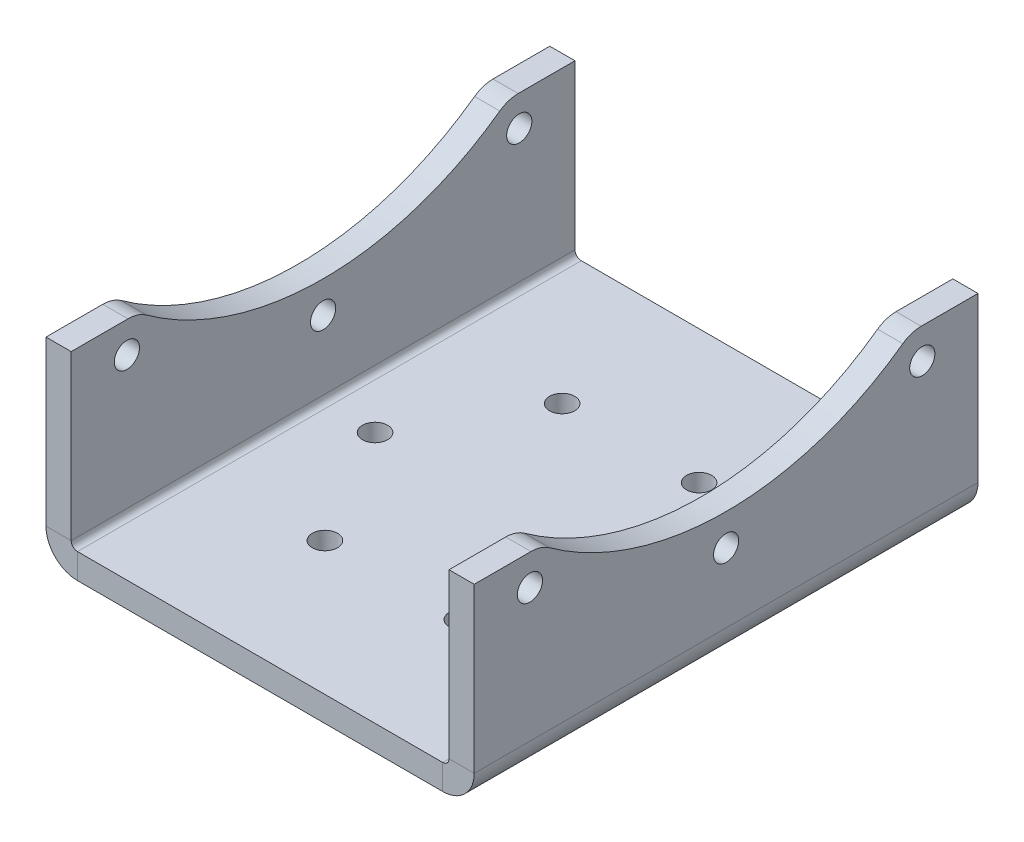
ISO-10303-21;
HEADER;
FILE_DESCRIPTION(('STEP AP214'),'2;1');
FILE_NAME('part.step','',(''),(''),'','','');
FILE_SCHEMA(('AUTOMOTIVE_DESIGN { 1 0 10303 214 1 1 1 1 }'));
ENDSEC;
DATA;
#1=APPLICATION_CONTEXT('core data for automotive mechanical design processes');
#2=APPLICATION_PROTOCOL_DEFINITION('international standard','automotive_design',2000,#1);
#3=PRODUCT_CONTEXT('',#1,'mechanical');
#4=PRODUCT('Part','Part','',(#3));
#5=PRODUCT_RELATED_PRODUCT_CATEGORY('part','',(#4));
#6=PRODUCT_DEFINITION_FORMATION('','',#4);
#7=PRODUCT_DEFINITION_CONTEXT('part definition',#1,'design');
#8=PRODUCT_DEFINITION('design','',#6,#7);
#9=PRODUCT_DEFINITION_SHAPE('','',#8);
#10=(LENGTH_UNIT() NAMED_UNIT(*) SI_UNIT(.MILLI.,.METRE.));
#11=(NAMED_UNIT(*) PLANE_ANGLE_UNIT() SI_UNIT($,.RADIAN.));
#12=(NAMED_UNIT(*) SI_UNIT($,.STERADIAN.) SOLID_ANGLE_UNIT());
#13=UNCERTAINTY_MEASURE_WITH_UNIT(LENGTH_MEASURE(1.E-05),#10,'distance_accuracy_value','');
#14=(GEOMETRIC_REPRESENTATION_CONTEXT(3) GLOBAL_UNCERTAINTY_ASSIGNED_CONTEXT((#13)) GLOBAL_UNIT_ASSIGNED_CONTEXT((#10,
#11,#12)) REPRESENTATION_CONTEXT('',''));
#15=CARTESIAN_POINT('',(0.,0.,0.));
#16=DIRECTION('',(0.,0.,1.));
#17=DIRECTION('',(1.,0.,0.));
#18=AXIS2_PLACEMENT_3D('',#15,#16,#17);
#19=CARTESIAN_POINT('',(-34.,27.,80.));
#20=DIRECTION('',(0.,1.,0.));
#21=DIRECTION('',(0.,0.,1.));
#22=AXIS2_PLACEMENT_3D('',#19,#20,#21);
#23=PLANE('',#22);
#24=DIRECTION('',(0.,0.,-1.));
#25=VECTOR('',#24,1.);
#26=CARTESIAN_POINT('',(-34.,27.,80.));
#27=LINE('',#26,#25);
#28=CARTESIAN_POINT('',(-34.,27.,9.01613323034062));
#29=VERTEX_POINT('',#28);
#30=CARTESIAN_POINT('',(-34.,27.,0.));
#31=VERTEX_POINT('',#30);
#32=EDGE_CURVE('E300',#29,#31,#27,.T.);
#33=ORIENTED_EDGE('',*,*,#32,.F.);
#34=DIRECTION('',(1.,0.,0.));
#35=VECTOR('',#34,1.);
#36=CARTESIAN_POINT('',(-30.,27.,9.01613323034061));
#37=LINE('',#36,#35);
#38=CARTESIAN_POINT('',(-30.,27.,9.01613323034062));
#39=VERTEX_POINT('',#38);
#40=EDGE_CURVE('E346',#29,#39,#37,.T.);
#41=ORIENTED_EDGE('',*,*,#40,.T.);
#42=DIRECTION('',(0.,0.,-1.));
#43=VECTOR('',#42,1.);
#44=CARTESIAN_POINT('',(-30.,27.,80.));
#45=LINE('',#44,#43);
#46=CARTESIAN_POINT('',(-30.,27.,0.));
#47=VERTEX_POINT('',#46);
#48=EDGE_CURVE('E198',#39,#47,#45,.T.);
#49=ORIENTED_EDGE('',*,*,#48,.T.);
#50=DIRECTION('',(1.,0.,0.));
#51=VECTOR('',#50,1.);
#52=CARTESIAN_POINT('',(-34.,27.,0.));
#53=LINE('',#52,#51);
#54=EDGE_CURVE('E238',#31,#47,#53,.T.);
#55=ORIENTED_EDGE('',*,*,#54,.F.);
#56=EDGE_LOOP('',(#33,#41,#49,#55));
#57=FACE_BOUND('',#56,.T.);
#58=ADVANCED_FACE('F38',(#57),#23,.T.);
#59=CARTESIAN_POINT('',(30.,27.,80.));
#60=DIRECTION('',(0.,1.,0.));
#61=DIRECTION('',(0.,0.,1.));
#62=AXIS2_PLACEMENT_3D('',#59,#60,#61);
#63=PLANE('',#62);
#64=DIRECTION('',(0.,0.,-1.));
#65=VECTOR('',#64,1.);
#66=CARTESIAN_POINT('',(30.,27.,80.));
#67=LINE('',#66,#65);
#68=CARTESIAN_POINT('',(30.,27.,9.0161332303406));
#69=VERTEX_POINT('',#68);
#70=CARTESIAN_POINT('',(30.,27.,0.));
#71=VERTEX_POINT('',#70);
#72=EDGE_CURVE('E281',#69,#71,#67,.T.);
#73=ORIENTED_EDGE('',*,*,#72,.F.);
#74=DIRECTION('',(1.,0.,0.));
#75=VECTOR('',#74,1.);
#76=CARTESIAN_POINT('',(34.,27.,9.0161332303406));
#77=LINE('',#76,#75);
#78=CARTESIAN_POINT('',(34.,27.,9.0161332303406));
#79=VERTEX_POINT('',#78);
#80=EDGE_CURVE('E63',#69,#79,#77,.T.);
#81=ORIENTED_EDGE('',*,*,#80,.T.);
#82=DIRECTION('',(0.,0.,-1.));
#83=VECTOR('',#82,1.);
#84=CARTESIAN_POINT('',(34.,27.,80.));
#85=LINE('',#84,#83);
#86=CARTESIAN_POINT('',(34.,27.,0.));
#87=VERTEX_POINT('',#86);
#88=EDGE_CURVE('E285',#79,#87,#85,.T.);
#89=ORIENTED_EDGE('',*,*,#88,.T.);
#90=DIRECTION('',(1.,0.,0.));
#91=VECTOR('',#90,1.);
#92=CARTESIAN_POINT('',(30.,27.,0.));
#93=LINE('',#92,#91);
#94=EDGE_CURVE('E257',#71,#87,#93,.T.);
#95=ORIENTED_EDGE('',*,*,#94,.F.);
#96=EDGE_LOOP('',(#73,#81,#89,#95));
#97=FACE_BOUND('',#96,.T.);
#98=ADVANCED_FACE('F428',(#97),#63,.T.);
#99=CARTESIAN_POINT('',(30.,1.00000000000001,80.));
#100=DIRECTION('',(0.,0.,1.));
#101=DIRECTION('',(1.,0.,0.));
#102=AXIS2_PLACEMENT_3D('',#99,#100,#101);
#103=PLANE('',#102);
#104=DIRECTION('',(1.,0.,0.));
#105=VECTOR('',#104,1.);
#106=CARTESIAN_POINT('',(30.,1.00000000000001,80.));
#107=LINE('',#106,#105);
#108=CARTESIAN_POINT('',(30.,1.00000000000001,80.));
#109=VERTEX_POINT('',#108);
#110=CARTESIAN_POINT('',(34.,1.00000000000001,80.));
#111=VERTEX_POINT('',#110);
#112=EDGE_CURVE('E314',#109,#111,#107,.T.);
#113=ORIENTED_EDGE('',*,*,#112,.F.);
#114=CARTESIAN_POINT('',(29.,1.00000000000001,80.));
#115=DIRECTION('',(0.,0.,1.));
#116=DIRECTION('',(1.,0.,0.));
#117=AXIS2_PLACEMENT_3D('',#114,#115,#116);
#118=CIRCLE('',#117,1.);
#119=CARTESIAN_POINT('',(29.,0.,80.));
#120=VERTEX_POINT('',#119);
#121=EDGE_CURVE('E226',#109,#120,#118,.F.);
#122=ORIENTED_EDGE('',*,*,#121,.T.);
#123=DIRECTION('',(0.,1.,0.));
#124=VECTOR('',#123,1.);
#125=CARTESIAN_POINT('',(29.,-3.99999999999999,80.));
#126=LINE('',#125,#124);
#127=CARTESIAN_POINT('',(29.,-3.99999999999999,80.));
#128=VERTEX_POINT('',#127);
#129=EDGE_CURVE('E312',#128,#120,#126,.T.);
#130=ORIENTED_EDGE('',*,*,#129,.F.);
#131=CARTESIAN_POINT('',(29.,1.00000000000001,80.));
#132=DIRECTION('',(0.,0.,1.));
#133=DIRECTION('',(1.,0.,0.));
#134=AXIS2_PLACEMENT_3D('',#131,#132,#133);
#135=CIRCLE('',#134,5.);
#136=EDGE_CURVE('E214',#111,#128,#135,.F.);
#137=ORIENTED_EDGE('',*,*,#136,.F.);
#138=EDGE_LOOP('',(#113,#122,#130,#137));
#139=FACE_BOUND('',#138,.T.);
#140=ADVANCED_FACE('F434',(#139),#103,.T.);
#141=CARTESIAN_POINT('',(29.,-3.99999999999999,80.));
#142=DIRECTION('',(0.,0.,1.));
#143=DIRECTION('',(1.,0.,0.));
#144=AXIS2_PLACEMENT_3D('',#141,#142,#143);
#145=PLANE('',#144);
#146=DIRECTION('',(0.,-1.,0.));
#147=VECTOR('',#146,1.);
#148=CARTESIAN_POINT('',(30.,0.,80.));
#149=LINE('',#148,#147);
#150=CARTESIAN_POINT('',(30.,27.,80.));
#151=VERTEX_POINT('',#150);
#152=EDGE_CURVE('E223',#151,#109,#149,.T.);
#153=ORIENTED_EDGE('',*,*,#152,.T.);
#154=ORIENTED_EDGE('',*,*,#112,.T.);
#155=DIRECTION('',(0.,1.,0.));
#156=VECTOR('',#155,1.);
#157=CARTESIAN_POINT('',(34.,0.,80.));
#158=LINE('',#157,#156);
#159=CARTESIAN_POINT('',(34.,27.,80.));
#160=VERTEX_POINT('',#159);
#161=EDGE_CURVE('E217',#160,#111,#158,.F.);
#162=ORIENTED_EDGE('',*,*,#161,.F.);
#163=DIRECTION('',(1.,0.,0.));
#164=VECTOR('',#163,1.);
#165=CARTESIAN_POINT('',(30.,27.,80.));
#166=LINE('',#165,#164);
#167=EDGE_CURVE('E220',#151,#160,#166,.T.);
#168=ORIENTED_EDGE('',*,*,#167,.F.);
#169=EDGE_LOOP('',(#153,#154,#162,#168));
#170=FACE_BOUND('',#169,.T.);
#171=ADVANCED_FACE('F474',(#170),#145,.T.);
#172=CARTESIAN_POINT('',(29.,0.,0.));
#173=DIRECTION('',(0.,0.,-1.));
#174=DIRECTION('',(-1.,0.,0.));
#175=AXIS2_PLACEMENT_3D('',#172,#173,#174);
#176=PLANE('',#175);
#177=DIRECTION('',(0.,-1.,0.));
#178=VECTOR('',#177,1.);
#179=CARTESIAN_POINT('',(29.,0.,0.));
#180=LINE('',#179,#178);
#181=CARTESIAN_POINT('',(29.,0.,0.));
#182=VERTEX_POINT('',#181);
#183=CARTESIAN_POINT('',(29.,-3.99999999999999,0.));
#184=VERTEX_POINT('',#183);
#185=EDGE_CURVE('E310',#182,#184,#180,.T.);
#186=ORIENTED_EDGE('',*,*,#185,.F.);
#187=CARTESIAN_POINT('',(29.,1.00000000000001,0.));
#188=DIRECTION('',(0.,0.,1.));
#189=DIRECTION('',(1.,0.,0.));
#190=AXIS2_PLACEMENT_3D('',#187,#188,#189);
#191=CIRCLE('',#190,1.);
#192=CARTESIAN_POINT('',(30.,1.00000000000001,0.));
#193=VERTEX_POINT('',#192);
#194=EDGE_CURVE('E263',#193,#182,#191,.F.);
#195=ORIENTED_EDGE('',*,*,#194,.F.);
#196=DIRECTION('',(-1.,0.,0.));
#197=VECTOR('',#196,1.);
#198=CARTESIAN_POINT('',(34.,1.00000000000001,0.));
#199=LINE('',#198,#197);
#200=CARTESIAN_POINT('',(34.,1.00000000000001,0.));
#201=VERTEX_POINT('',#200);
#202=EDGE_CURVE('E308',#201,#193,#199,.T.);
#203=ORIENTED_EDGE('',*,*,#202,.F.);
#204=CARTESIAN_POINT('',(29.,1.00000000000001,0.));
#205=DIRECTION('',(0.,0.,1.));
#206=DIRECTION('',(1.,0.,0.));
#207=AXIS2_PLACEMENT_3D('',#204,#205,#206);
#208=CIRCLE('',#207,5.);
#209=EDGE_CURVE('E251',#201,#184,#208,.F.);
#210=ORIENTED_EDGE('',*,*,#209,.T.);
#211=EDGE_LOOP('',(#186,#195,#203,#210));
#212=FACE_BOUND('',#211,.T.);
#213=ADVANCED_FACE('F470',(#212),#176,.T.);
#214=CARTESIAN_POINT('',(34.,1.00000000000001,0.));
#215=DIRECTION('',(0.,0.,-1.));
#216=DIRECTION('',(-1.,0.,0.));
#217=AXIS2_PLACEMENT_3D('',#214,#215,#216);
#218=PLANE('',#217);
#219=DIRECTION('',(-1.,0.,0.));
#220=VECTOR('',#219,1.);
#221=CARTESIAN_POINT('',(-30.,0.,0.));
#222=LINE('',#221,#220);
#223=CARTESIAN_POINT('',(-29.,0.,0.));
#224=VERTEX_POINT('',#223);
#225=EDGE_CURVE('E266',#182,#224,#222,.T.);
#226=ORIENTED_EDGE('',*,*,#225,.F.);
#227=ORIENTED_EDGE('',*,*,#185,.T.);
#228=DIRECTION('',(-1.,0.,0.));
#229=VECTOR('',#228,1.);
#230=CARTESIAN_POINT('',(-30.,-4.,0.));
#231=LINE('',#230,#229);
#232=CARTESIAN_POINT('',(-29.,-4.,0.));
#233=VERTEX_POINT('',#232);
#234=EDGE_CURVE('E248',#184,#233,#231,.T.);
#235=ORIENTED_EDGE('',*,*,#234,.T.);
#236=DIRECTION('',(0.,1.,0.));
#237=VECTOR('',#236,1.);
#238=CARTESIAN_POINT('',(-29.,-4.,0.));
#239=LINE('',#238,#237);
#240=EDGE_CURVE('E197',#233,#224,#239,.T.);
#241=ORIENTED_EDGE('',*,*,#240,.T.);
#242=EDGE_LOOP('',(#226,#227,#235,#241));
#243=FACE_BOUND('',#242,.T.);
#244=ADVANCED_FACE('F466',(#243),#218,.T.);
#245=CARTESIAN_POINT('',(-29.,0.,80.));
#246=DIRECTION('',(0.,0.,1.));
#247=DIRECTION('',(1.,0.,0.));
#248=AXIS2_PLACEMENT_3D('',#245,#246,#247);
#249=PLANE('',#248);
#250=DIRECTION('',(0.,-1.,0.));
#251=VECTOR('',#250,1.);
#252=CARTESIAN_POINT('',(-29.,0.,80.));
#253=LINE('',#252,#251);
#254=CARTESIAN_POINT('',(-29.,0.,80.));
#255=VERTEX_POINT('',#254);
#256=CARTESIAN_POINT('',(-29.,-4.,80.));
#257=VERTEX_POINT('',#256);
#258=EDGE_CURVE('E306',#255,#257,#253,.T.);
#259=ORIENTED_EDGE('',*,*,#258,.F.);
#260=CARTESIAN_POINT('',(-29.,1.,80.));
#261=DIRECTION('',(0.,0.,1.));
#262=DIRECTION('',(1.,0.,0.));
#263=AXIS2_PLACEMENT_3D('',#260,#261,#262);
#264=CIRCLE('',#263,1.);
#265=CARTESIAN_POINT('',(-30.,1.,80.));
#266=VERTEX_POINT('',#265);
#267=EDGE_CURVE('E232',#255,#266,#264,.F.);
#268=ORIENTED_EDGE('',*,*,#267,.T.);
#269=DIRECTION('',(1.,0.,0.));
#270=VECTOR('',#269,1.);
#271=CARTESIAN_POINT('',(-34.,1.,80.));
#272=LINE('',#271,#270);
#273=CARTESIAN_POINT('',(-34.,1.,80.));
#274=VERTEX_POINT('',#273);
#275=EDGE_CURVE('E184',#274,#266,#272,.T.);
#276=ORIENTED_EDGE('',*,*,#275,.F.);
#277=CARTESIAN_POINT('',(-29.,1.,80.));
#278=DIRECTION('',(0.,0.,1.));
#279=DIRECTION('',(1.,0.,0.));
#280=AXIS2_PLACEMENT_3D('',#277,#278,#279);
#281=CIRCLE('',#280,5.);
#282=EDGE_CURVE('E205',#257,#274,#281,.F.);
#283=ORIENTED_EDGE('',*,*,#282,.F.);
#284=EDGE_LOOP('',(#259,#268,#276,#283));
#285=FACE_BOUND('',#284,.T.);
#286=ADVANCED_FACE('F462',(#285),#249,.T.);
#287=CARTESIAN_POINT('',(-34.,1.,80.));
#288=DIRECTION('',(0.,0.,1.));
#289=DIRECTION('',(1.,0.,0.));
#290=AXIS2_PLACEMENT_3D('',#287,#288,#289);
#291=PLANE('',#290);
#292=DIRECTION('',(-1.,0.,0.));
#293=VECTOR('',#292,1.);
#294=CARTESIAN_POINT('',(-30.,0.,80.));
#295=LINE('',#294,#293);
#296=EDGE_CURVE('E229',#120,#255,#295,.T.);
#297=ORIENTED_EDGE('',*,*,#296,.T.);
#298=ORIENTED_EDGE('',*,*,#258,.T.);
#299=DIRECTION('',(-1.,0.,0.));
#300=VECTOR('',#299,1.);
#301=CARTESIAN_POINT('',(-30.,-4.,80.));
#302=LINE('',#301,#300);
#303=EDGE_CURVE('E211',#128,#257,#302,.T.);
#304=ORIENTED_EDGE('',*,*,#303,.F.);
#305=ORIENTED_EDGE('',*,*,#129,.T.);
#306=EDGE_LOOP('',(#297,#298,#304,#305));
#307=FACE_BOUND('',#306,.T.);
#308=ADVANCED_FACE('F458',(#307),#291,.T.);
#309=CARTESIAN_POINT('',(-30.,1.,0.));
#310=DIRECTION('',(0.,0.,-1.));
#311=DIRECTION('',(-1.,0.,0.));
#312=AXIS2_PLACEMENT_3D('',#309,#310,#311);
#313=PLANE('',#312);
#314=DIRECTION('',(-1.,0.,0.));
#315=VECTOR('',#314,1.);
#316=CARTESIAN_POINT('',(-30.,1.,0.));
#317=LINE('',#316,#315);
#318=CARTESIAN_POINT('',(-30.,1.,0.));
#319=VERTEX_POINT('',#318);
#320=CARTESIAN_POINT('',(-34.,1.,0.));
#321=VERTEX_POINT('',#320);
#322=EDGE_CURVE('E303',#319,#321,#317,.T.);
#323=ORIENTED_EDGE('',*,*,#322,.F.);
#324=CARTESIAN_POINT('',(-29.,1.,0.));
#325=DIRECTION('',(0.,0.,1.));
#326=DIRECTION('',(1.,0.,0.));
#327=AXIS2_PLACEMENT_3D('',#324,#325,#326);
#328=CIRCLE('',#327,1.);
#329=EDGE_CURVE('E188',#224,#319,#328,.F.);
#330=ORIENTED_EDGE('',*,*,#329,.F.);
#331=ORIENTED_EDGE('',*,*,#240,.F.);
#332=CARTESIAN_POINT('',(-29.,1.,0.));
#333=DIRECTION('',(0.,0.,1.));
#334=DIRECTION('',(1.,0.,0.));
#335=AXIS2_PLACEMENT_3D('',#332,#333,#334);
#336=CIRCLE('',#335,5.);
#337=EDGE_CURVE('E245',#233,#321,#336,.F.);
#338=ORIENTED_EDGE('',*,*,#337,.T.);
#339=EDGE_LOOP('',(#323,#330,#331,#338));
#340=FACE_BOUND('',#339,.T.);
#341=ADVANCED_FACE('F452',(#340),#313,.T.);
#342=CARTESIAN_POINT('',(-29.,-4.,0.));
#343=DIRECTION('',(0.,0.,-1.));
#344=DIRECTION('',(-1.,0.,0.));
#345=AXIS2_PLACEMENT_3D('',#342,#343,#344);
#346=PLANE('',#345);
#347=DIRECTION('',(0.,1.,0.));
#348=VECTOR('',#347,1.);
#349=CARTESIAN_POINT('',(-30.,0.,0.));
#350=LINE('',#349,#348);
#351=EDGE_CURVE('E235',#319,#47,#350,.T.);
#352=ORIENTED_EDGE('',*,*,#351,.F.);
#353=ORIENTED_EDGE('',*,*,#322,.T.);
#354=DIRECTION('',(0.,1.,0.));
#355=VECTOR('',#354,1.);
#356=CARTESIAN_POINT('',(-34.,0.,0.));
#357=LINE('',#356,#355);
#358=EDGE_CURVE('E242',#321,#31,#357,.T.);
#359=ORIENTED_EDGE('',*,*,#358,.T.);
#360=ORIENTED_EDGE('',*,*,#54,.T.);
#361=EDGE_LOOP('',(#352,#353,#359,#360));
#362=FACE_BOUND('',#361,.T.);
#363=ADVANCED_FACE('F448',(#362),#346,.T.);
#364=CARTESIAN_POINT('',(-30.,0.,80.));
#365=DIRECTION('',(-1.,0.,0.));
#366=DIRECTION('',(0.,0.,1.));
#367=AXIS2_PLACEMENT_3D('',#364,#365,#366);
#368=PLANE('',#367);
#369=CARTESIAN_POINT('',(-30.,22.1220992981278,71.1526183715011));
#370=DIRECTION('',(-1.,0.,0.));
#371=DIRECTION('',(0.,0.,1.));
#372=AXIS2_PLACEMENT_3D('',#369,#370,#371);
#373=CIRCLE('',#372,2.);
#374=CARTESIAN_POINT('',(-30.,22.1220992981278,73.1526183715011));
#375=VERTEX_POINT('',#374);
#376=EDGE_CURVE('E239',#375,#375,#373,.T.);
#377=ORIENTED_EDGE('',*,*,#376,.T.);
#378=EDGE_LOOP('',(#377));
#379=FACE_BOUND('',#378,.T.);
#380=CARTESIAN_POINT('',(-30.,22.1220992981278,8.84738162849893));
#381=DIRECTION('',(-1.,0.,0.));
#382=DIRECTION('',(0.,0.,1.));
#383=AXIS2_PLACEMENT_3D('',#380,#381,#382);
#384=CIRCLE('',#383,2.00000000000001);
#385=CARTESIAN_POINT('',(-30.,22.1220992981278,10.8473816284989));
#386=VERTEX_POINT('',#385);
#387=EDGE_CURVE('E328',#386,#386,#384,.T.);
#388=ORIENTED_EDGE('',*,*,#387,.T.);
#389=EDGE_LOOP('',(#388));
#390=FACE_BOUND('',#389,.T.);
#391=CARTESIAN_POINT('',(-30.,12.,40.));
#392=DIRECTION('',(-1.,0.,0.));
#393=DIRECTION('',(0.,0.,1.));
#394=AXIS2_PLACEMENT_3D('',#391,#392,#393);
#395=CIRCLE('',#394,1.99999999999998);
#396=CARTESIAN_POINT('',(-30.,12.,42.));
#397=VERTEX_POINT('',#396);
#398=EDGE_CURVE('E323',#397,#397,#395,.T.);
#399=ORIENTED_EDGE('',*,*,#398,.T.);
#400=EDGE_LOOP('',(#399));
#401=FACE_BOUND('',#400,.T.);
#402=CARTESIAN_POINT('',(-30.,65.,40.));
#403=DIRECTION('',(-1.,0.,0.));
#404=DIRECTION('',(0.,0.,1.));
#405=AXIS2_PLACEMENT_3D('',#402,#403,#404);
#406=CIRCLE('',#405,48.);
#407=CARTESIAN_POINT('',(-30.,26.0566037735849,11.9391395293651));
#408=VERTEX_POINT('',#407);
#409=CARTESIAN_POINT('',(-30.,26.0566037735849,68.0608604706349));
#410=VERTEX_POINT('',#409);
#411=EDGE_CURVE('E324',#408,#410,#406,.T.);
#412=ORIENTED_EDGE('',*,*,#411,.T.);
#413=CARTESIAN_POINT('',(-30.,22.,70.9838667696594));
#414=DIRECTION('',(-1.,0.,0.));
#415=DIRECTION('',(0.,0.,1.));
#416=AXIS2_PLACEMENT_3D('',#413,#414,#415);
#417=CIRCLE('',#416,5.);
#418=CARTESIAN_POINT('',(-30.,27.,70.9838667696594));
#419=VERTEX_POINT('',#418);
#420=EDGE_CURVE('E194',#410,#419,#417,.F.);
#421=ORIENTED_EDGE('',*,*,#420,.T.);
#422=CARTESIAN_POINT('',(-30.,27.,80.));
#423=VERTEX_POINT('',#422);
#424=EDGE_CURVE('E191',#423,#419,#45,.T.);
#425=ORIENTED_EDGE('',*,*,#424,.F.);
#426=DIRECTION('',(0.,1.,0.));
#427=VECTOR('',#426,1.);
#428=CARTESIAN_POINT('',(-30.,0.,80.));
#429=LINE('',#428,#427);
#430=EDGE_CURVE('E177',#266,#423,#429,.T.);
#431=ORIENTED_EDGE('',*,*,#430,.F.);
#432=DIRECTION('',(0.,0.,-1.));
#433=VECTOR('',#432,1.);
#434=CARTESIAN_POINT('',(-30.,1.,80.));
#435=LINE('',#434,#433);
#436=EDGE_CURVE('E234',#266,#319,#435,.T.);
#437=ORIENTED_EDGE('',*,*,#436,.T.);
#438=ORIENTED_EDGE('',*,*,#351,.T.);
#439=ORIENTED_EDGE('',*,*,#48,.F.);
#440=CARTESIAN_POINT('',(-30.,22.,9.01613323034061));
#441=DIRECTION('',(-1.,0.,0.));
#442=DIRECTION('',(0.,0.,1.));
#443=AXIS2_PLACEMENT_3D('',#440,#441,#442);
#444=CIRCLE('',#443,5.);
#445=EDGE_CURVE('E337',#39,#408,#444,.F.);
#446=ORIENTED_EDGE('',*,*,#445,.T.);
#447=EDGE_LOOP('',(#412,#421,#425,#431,#437,#438,#439,#446));
#448=FACE_BOUND('',#447,.T.);
#449=ADVANCED_FACE('F193',(#379,#390,#401,#448),#368,.F.);
#450=ORIENTED_EDGE('',*,*,#424,.T.);
#451=DIRECTION('',(1.,0.,0.));
#452=VECTOR('',#451,1.);
#453=CARTESIAN_POINT('',(-34.,27.,70.9838667696594));
#454=LINE('',#453,#452);
#455=CARTESIAN_POINT('',(-34.,27.,70.9838667696594));
#456=VERTEX_POINT('',#455);
#457=EDGE_CURVE('E340',#419,#456,#454,.F.);
#458=ORIENTED_EDGE('',*,*,#457,.T.);
#459=CARTESIAN_POINT('',(-34.,27.,80.));
#460=VERTEX_POINT('',#459);
#461=EDGE_CURVE('E202',#460,#456,#27,.T.);
#462=ORIENTED_EDGE('',*,*,#461,.F.);
#463=DIRECTION('',(1.,0.,0.));
#464=VECTOR('',#463,1.);
#465=CARTESIAN_POINT('',(-34.,27.,80.));
#466=LINE('',#465,#464);
#467=EDGE_CURVE('E182',#460,#423,#466,.T.);
#468=ORIENTED_EDGE('',*,*,#467,.T.);
#469=EDGE_LOOP('',(#450,#458,#462,#468));
#470=FACE_BOUND('',#469,.T.);
#471=ADVANCED_FACE('F200',(#470),#23,.T.);
#472=CARTESIAN_POINT('',(-34.,0.,80.));
#473=DIRECTION('',(-1.,0.,0.));
#474=DIRECTION('',(0.,0.,1.));
#475=AXIS2_PLACEMENT_3D('',#472,#473,#474);
#476=PLANE('',#475);
#477=CARTESIAN_POINT('',(-34.,22.1220992981278,71.1526183715011));
#478=DIRECTION('',(-1.,0.,0.));
#479=DIRECTION('',(0.,0.,1.));
#480=AXIS2_PLACEMENT_3D('',#477,#478,#479);
#481=CIRCLE('',#480,2.);
#482=CARTESIAN_POINT('',(-34.,22.1220992981278,73.1526183715011));
#483=VERTEX_POINT('',#482);
#484=EDGE_CURVE('E378',#483,#483,#481,.T.);
#485=ORIENTED_EDGE('',*,*,#484,.F.);
#486=EDGE_LOOP('',(#485));
#487=FACE_BOUND('',#486,.T.);
#488=CARTESIAN_POINT('',(-34.,22.1220992981278,8.84738162849893));
#489=DIRECTION('',(-1.,0.,0.));
#490=DIRECTION('',(0.,0.,1.));
#491=AXIS2_PLACEMENT_3D('',#488,#489,#490);
#492=CIRCLE('',#491,2.00000000000001);
#493=CARTESIAN_POINT('',(-34.,22.1220992981278,10.8473816284989));
#494=VERTEX_POINT('',#493);
#495=EDGE_CURVE('E387',#494,#494,#492,.T.);
#496=ORIENTED_EDGE('',*,*,#495,.F.);
#497=EDGE_LOOP('',(#496));
#498=FACE_BOUND('',#497,.T.);
#499=CARTESIAN_POINT('',(-34.,12.,40.));
#500=DIRECTION('',(-1.,0.,0.));
#501=DIRECTION('',(0.,0.,1.));
#502=AXIS2_PLACEMENT_3D('',#499,#500,#501);
#503=CIRCLE('',#502,1.99999999999998);
#504=CARTESIAN_POINT('',(-34.,12.,42.));
#505=VERTEX_POINT('',#504);
#506=EDGE_CURVE('E952',#505,#505,#503,.T.);
#507=ORIENTED_EDGE('',*,*,#506,.F.);
#508=EDGE_LOOP('',(#507));
#509=FACE_BOUND('',#508,.T.);
#510=ORIENTED_EDGE('',*,*,#461,.T.);
#511=CARTESIAN_POINT('',(-34.,22.,70.9838667696594));
#512=DIRECTION('',(-1.,0.,0.));
#513=DIRECTION('',(0.,0.,1.));
#514=AXIS2_PLACEMENT_3D('',#511,#512,#513);
#515=CIRCLE('',#514,5.);
#516=CARTESIAN_POINT('',(-34.,26.0566037735849,68.0608604706349));
#517=VERTEX_POINT('',#516);
#518=EDGE_CURVE('E344',#456,#517,#515,.T.);
#519=ORIENTED_EDGE('',*,*,#518,.T.);
#520=CARTESIAN_POINT('',(-34.,65.,40.));
#521=DIRECTION('',(-1.,0.,0.));
#522=DIRECTION('',(0.,0.,1.));
#523=AXIS2_PLACEMENT_3D('',#520,#521,#522);
#524=CIRCLE('',#523,48.);
#525=CARTESIAN_POINT('',(-34.,26.0566037735849,11.9391395293651));
#526=VERTEX_POINT('',#525);
#527=EDGE_CURVE('E393',#526,#517,#524,.T.);
#528=ORIENTED_EDGE('',*,*,#527,.F.);
#529=CARTESIAN_POINT('',(-34.,22.,9.01613323034061));
#530=DIRECTION('',(-1.,0.,0.));
#531=DIRECTION('',(0.,0.,1.));
#532=AXIS2_PLACEMENT_3D('',#529,#530,#531);
#533=CIRCLE('',#532,5.);
#534=EDGE_CURVE('E342',#526,#29,#533,.T.);
#535=ORIENTED_EDGE('',*,*,#534,.T.);
#536=ORIENTED_EDGE('',*,*,#32,.T.);
#537=ORIENTED_EDGE('',*,*,#358,.F.);
#538=DIRECTION('',(0.,0.,-1.));
#539=VECTOR('',#538,1.);
#540=CARTESIAN_POINT('',(-34.,1.,80.));
#541=LINE('',#540,#539);
#542=EDGE_CURVE('E297',#274,#321,#541,.T.);
#543=ORIENTED_EDGE('',*,*,#542,.F.);
#544=DIRECTION('',(0.,1.,0.));
#545=VECTOR('',#544,1.);
#546=CARTESIAN_POINT('',(-34.,0.,80.));
#547=LINE('',#546,#545);
#548=EDGE_CURVE('E203',#274,#460,#547,.T.);
#549=ORIENTED_EDGE('',*,*,#548,.T.);
#550=EDGE_LOOP('',(#510,#519,#528,#535,#536,#537,#543,#549));
#551=FACE_BOUND('',#550,.T.);
#552=ADVANCED_FACE('F441',(#487,#498,#509,#551),#476,.T.);
#553=CARTESIAN_POINT('',(-29.,1.,80.));
#554=DIRECTION('',(0.,0.,-1.));
#555=DIRECTION('',(-1.,0.,0.));
#556=AXIS2_PLACEMENT_3D('',#553,#554,#555);
#557=CYLINDRICAL_SURFACE('',#556,5.);
#558=ORIENTED_EDGE('',*,*,#337,.F.);
#559=DIRECTION('',(0.,0.,-1.));
#560=VECTOR('',#559,1.);
#561=CARTESIAN_POINT('',(-29.,-4.,80.));
#562=LINE('',#561,#560);
#563=EDGE_CURVE('E294',#257,#233,#562,.T.);
#564=ORIENTED_EDGE('',*,*,#563,.F.);
#565=ORIENTED_EDGE('',*,*,#282,.T.);
#566=ORIENTED_EDGE('',*,*,#542,.T.);
#567=EDGE_LOOP('',(#558,#564,#565,#566));
#568=FACE_BOUND('',#567,.T.);
#569=ADVANCED_FACE('F446',(#568),#557,.T.);
#570=CARTESIAN_POINT('',(-30.,-4.,80.));
#571=DIRECTION('',(0.,-1.,0.));
#572=DIRECTION('',(1.,0.,0.));
#573=AXIS2_PLACEMENT_3D('',#570,#571,#572);
#574=PLANE('',#573);
#575=CARTESIAN_POINT('',(-21.75,-4.,40.));
#576=DIRECTION('',(0.,-1.,0.));
#577=DIRECTION('',(1.,0.,0.));
#578=AXIS2_PLACEMENT_3D('',#575,#576,#577);
#579=CIRCLE('',#578,2.);
#580=CARTESIAN_POINT('',(-19.75,-4.,40.));
#581=VERTEX_POINT('',#580);
#582=EDGE_CURVE('E365',#581,#581,#579,.T.);
#583=ORIENTED_EDGE('',*,*,#582,.F.);
#584=EDGE_LOOP('',(#583));
#585=FACE_BOUND('',#584,.T.);
#586=CARTESIAN_POINT('',(10.8750000000001,-3.99999999999999,58.8360525323115));
#587=DIRECTION('',(0.,-1.,0.));
#588=DIRECTION('',(1.,0.,0.));
#589=AXIS2_PLACEMENT_3D('',#586,#587,#588);
#590=CIRCLE('',#589,2.);
#591=CARTESIAN_POINT('',(12.8750000000001,-3.99999999999999,58.8360525323115));
#592=VERTEX_POINT('',#591);
#593=EDGE_CURVE('E939',#592,#592,#590,.T.);
#594=ORIENTED_EDGE('',*,*,#593,.F.);
#595=EDGE_LOOP('',(#594));
#596=FACE_BOUND('',#595,.T.);
#597=CARTESIAN_POINT('',(-10.875,-4.,21.1639474676884));
#598=DIRECTION('',(0.,-1.,0.));
#599=DIRECTION('',(1.,0.,0.));
#600=AXIS2_PLACEMENT_3D('',#597,#598,#599);
#601=CIRCLE('',#600,2.00000000000008);
#602=CARTESIAN_POINT('',(-8.8749999999999,-4.,21.1639474676884));
#603=VERTEX_POINT('',#602);
#604=EDGE_CURVE('E941',#603,#603,#601,.T.);
#605=ORIENTED_EDGE('',*,*,#604,.F.);
#606=EDGE_LOOP('',(#605));
#607=FACE_BOUND('',#606,.T.);
#608=CARTESIAN_POINT('',(10.8749999999998,-3.99999999999999,21.1639474676884));
#609=DIRECTION('',(0.,-1.,0.));
#610=DIRECTION('',(1.,0.,0.));
#611=AXIS2_PLACEMENT_3D('',#608,#609,#610);
#612=CIRCLE('',#611,2.);
#613=CARTESIAN_POINT('',(12.8749999999998,-3.99999999999999,21.1639474676884));
#614=VERTEX_POINT('',#613);
#615=EDGE_CURVE('E945',#614,#614,#612,.T.);
#616=ORIENTED_EDGE('',*,*,#615,.F.);
#617=EDGE_LOOP('',(#616));
#618=FACE_BOUND('',#617,.T.);
#619=CARTESIAN_POINT('',(21.75,-3.99999999999999,39.9999999999999));
#620=DIRECTION('',(0.,-1.,0.));
#621=DIRECTION('',(1.,0.,0.));
#622=AXIS2_PLACEMENT_3D('',#619,#620,#621);
#623=CIRCLE('',#622,2.);
#624=CARTESIAN_POINT('',(23.75,-3.99999999999999,39.9999999999999));
#625=VERTEX_POINT('',#624);
#626=EDGE_CURVE('E936',#625,#625,#623,.T.);
#627=ORIENTED_EDGE('',*,*,#626,.F.);
#628=EDGE_LOOP('',(#627));
#629=FACE_BOUND('',#628,.T.);
#630=CARTESIAN_POINT('',(-10.875,-4.,58.8360525323116));
#631=DIRECTION('',(0.,-1.,0.));
#632=DIRECTION('',(1.,0.,0.));
#633=AXIS2_PLACEMENT_3D('',#630,#631,#632);
#634=CIRCLE('',#633,2.);
#635=CARTESIAN_POINT('',(-8.87499999999995,-4.,58.8360525323116));
#636=VERTEX_POINT('',#635);
#637=EDGE_CURVE('E933',#636,#636,#634,.T.);
#638=ORIENTED_EDGE('',*,*,#637,.F.);
#639=EDGE_LOOP('',(#638));
#640=FACE_BOUND('',#639,.T.);
#641=ORIENTED_EDGE('',*,*,#234,.F.);
#642=DIRECTION('',(0.,0.,-1.));
#643=VECTOR('',#642,1.);
#644=CARTESIAN_POINT('',(29.,-3.99999999999999,80.));
#645=LINE('',#644,#643);
#646=EDGE_CURVE('E291',#128,#184,#645,.T.);
#647=ORIENTED_EDGE('',*,*,#646,.F.);
#648=ORIENTED_EDGE('',*,*,#303,.T.);
#649=ORIENTED_EDGE('',*,*,#563,.T.);
#650=EDGE_LOOP('',(#641,#647,#648,#649));
#651=FACE_BOUND('',#650,.T.);
#652=ADVANCED_FACE('F588',(#585,#596,#607,#618,#629,#640,#651),#574,.T.);
#653=CARTESIAN_POINT('',(29.,1.00000000000001,80.));
#654=DIRECTION('',(0.,0.,-1.));
#655=DIRECTION('',(-1.,0.,0.));
#656=AXIS2_PLACEMENT_3D('',#653,#654,#655);
#657=CYLINDRICAL_SURFACE('',#656,5.);
#658=ORIENTED_EDGE('',*,*,#209,.F.);
#659=DIRECTION('',(0.,0.,-1.));
#660=VECTOR('',#659,1.);
#661=CARTESIAN_POINT('',(34.,1.00000000000001,80.));
#662=LINE('',#661,#660);
#663=EDGE_CURVE('E288',#111,#201,#662,.T.);
#664=ORIENTED_EDGE('',*,*,#663,.F.);
#665=ORIENTED_EDGE('',*,*,#136,.T.);
#666=ORIENTED_EDGE('',*,*,#646,.T.);
#667=EDGE_LOOP('',(#658,#664,#665,#666));
#668=FACE_BOUND('',#667,.T.);
#669=ADVANCED_FACE('F515',(#668),#657,.T.);
#670=CARTESIAN_POINT('',(34.,0.,80.));
#671=DIRECTION('',(1.,0.,0.));
#672=DIRECTION('',(0.,0.,-1.));
#673=AXIS2_PLACEMENT_3D('',#670,#671,#672);
#674=PLANE('',#673);
#675=CARTESIAN_POINT('',(34.,22.1220992981278,71.1526183715011));
#676=DIRECTION('',(-1.,0.,0.));
#677=DIRECTION('',(0.,0.,1.));
#678=AXIS2_PLACEMENT_3D('',#675,#676,#677);
#679=CIRCLE('',#678,2.);
#680=CARTESIAN_POINT('',(34.,22.1220992981278,73.1526183715011));
#681=VERTEX_POINT('',#680);
#682=EDGE_CURVE('E382',#681,#681,#679,.T.);
#683=ORIENTED_EDGE('',*,*,#682,.T.);
#684=EDGE_LOOP('',(#683));
#685=FACE_BOUND('',#684,.T.);
#686=CARTESIAN_POINT('',(34.,22.1220992981278,8.84738162849893));
#687=DIRECTION('',(-1.,0.,0.));
#688=DIRECTION('',(0.,0.,1.));
#689=AXIS2_PLACEMENT_3D('',#686,#687,#688);
#690=CIRCLE('',#689,2.00000000000001);
#691=CARTESIAN_POINT('',(34.,22.1220992981278,10.8473816284989));
#692=VERTEX_POINT('',#691);
#693=EDGE_CURVE('E955',#692,#692,#690,.T.);
#694=ORIENTED_EDGE('',*,*,#693,.T.);
#695=EDGE_LOOP('',(#694));
#696=FACE_BOUND('',#695,.T.);
#697=CARTESIAN_POINT('',(34.,12.,40.));
#698=DIRECTION('',(-1.,0.,0.));
#699=DIRECTION('',(0.,0.,1.));
#700=AXIS2_PLACEMENT_3D('',#697,#698,#699);
#701=CIRCLE('',#700,1.99999999999998);
#702=CARTESIAN_POINT('',(34.,12.,42.));
#703=VERTEX_POINT('',#702);
#704=EDGE_CURVE('E396',#703,#703,#701,.T.);
#705=ORIENTED_EDGE('',*,*,#704,.T.);
#706=EDGE_LOOP('',(#705));
#707=FACE_BOUND('',#706,.T.);
#708=ORIENTED_EDGE('',*,*,#88,.F.);
#709=CARTESIAN_POINT('',(34.,22.,9.0161332303406));
#710=DIRECTION('',(1.,0.,0.));
#711=DIRECTION('',(0.,0.,-1.));
#712=AXIS2_PLACEMENT_3D('',#709,#710,#711);
#713=CIRCLE('',#712,5.);
#714=CARTESIAN_POINT('',(34.,26.0566037735849,11.9391395293651));
#715=VERTEX_POINT('',#714);
#716=EDGE_CURVE('E47',#79,#715,#713,.T.);
#717=ORIENTED_EDGE('',*,*,#716,.T.);
#718=CARTESIAN_POINT('',(34.,65.,40.));
#719=DIRECTION('',(-1.,0.,0.));
#720=DIRECTION('',(0.,0.,1.));
#721=AXIS2_PLACEMENT_3D('',#718,#719,#720);
#722=CIRCLE('',#721,48.);
#723=CARTESIAN_POINT('',(34.,26.0566037735849,68.0608604706349));
#724=VERTEX_POINT('',#723);
#725=EDGE_CURVE('E391',#715,#724,#722,.T.);
#726=ORIENTED_EDGE('',*,*,#725,.T.);
#727=CARTESIAN_POINT('',(34.,22.,70.9838667696594));
#728=DIRECTION('',(1.,0.,0.));
#729=DIRECTION('',(0.,0.,-1.));
#730=AXIS2_PLACEMENT_3D('',#727,#728,#729);
#731=CIRCLE('',#730,5.);
#732=CARTESIAN_POINT('',(34.,27.,70.9838667696594));
#733=VERTEX_POINT('',#732);
#734=EDGE_CURVE('E55',#724,#733,#731,.T.);
#735=ORIENTED_EDGE('',*,*,#734,.T.);
#736=EDGE_CURVE('E286',#160,#733,#85,.T.);
#737=ORIENTED_EDGE('',*,*,#736,.F.);
#738=ORIENTED_EDGE('',*,*,#161,.T.);
#739=ORIENTED_EDGE('',*,*,#663,.T.);
#740=DIRECTION('',(0.,1.,0.));
#741=VECTOR('',#740,1.);
#742=CARTESIAN_POINT('',(34.,0.,0.));
#743=LINE('',#742,#741);
#744=EDGE_CURVE('E254',#87,#201,#743,.F.);
#745=ORIENTED_EDGE('',*,*,#744,.F.);
#746=EDGE_LOOP('',(#708,#717,#726,#735,#737,#738,#739,#745));
#747=FACE_BOUND('',#746,.T.);
#748=ADVANCED_FACE('F495',(#685,#696,#707,#747),#674,.T.);
#749=ORIENTED_EDGE('',*,*,#736,.T.);
#750=DIRECTION('',(1.,0.,0.));
#751=VECTOR('',#750,1.);
#752=CARTESIAN_POINT('',(30.,27.,70.9838667696594));
#753=LINE('',#752,#751);
#754=CARTESIAN_POINT('',(30.,27.,70.9838667696594));
#755=VERTEX_POINT('',#754);
#756=EDGE_CURVE('E11',#733,#755,#753,.F.);
#757=ORIENTED_EDGE('',*,*,#756,.T.);
#758=EDGE_CURVE('E282',#151,#755,#67,.T.);
#759=ORIENTED_EDGE('',*,*,#758,.F.);
#760=ORIENTED_EDGE('',*,*,#167,.T.);
#761=EDGE_LOOP('',(#749,#757,#759,#760));
#762=FACE_BOUND('',#761,.T.);
#763=ADVANCED_FACE('F436',(#762),#63,.T.);
#764=CARTESIAN_POINT('',(30.,0.,80.));
#765=DIRECTION('',(1.,0.,0.));
#766=DIRECTION('',(0.,0.,-1.));
#767=AXIS2_PLACEMENT_3D('',#764,#765,#766);
#768=PLANE('',#767);
#769=CARTESIAN_POINT('',(30.,22.1220992981278,71.1526183715011));
#770=DIRECTION('',(1.,0.,0.));
#771=DIRECTION('',(0.,0.,-1.));
#772=AXIS2_PLACEMENT_3D('',#769,#770,#771);
#773=CIRCLE('',#772,2.);
#774=CARTESIAN_POINT('',(30.,22.1220992981278,69.1526183715011));
#775=VERTEX_POINT('',#774);
#776=EDGE_CURVE('E329',#775,#775,#773,.T.);
#777=ORIENTED_EDGE('',*,*,#776,.T.);
#778=EDGE_LOOP('',(#777));
#779=FACE_BOUND('',#778,.T.);
#780=CARTESIAN_POINT('',(30.,22.1220992981278,8.84738162849893));
#781=DIRECTION('',(1.,0.,0.));
#782=DIRECTION('',(0.,0.,-1.));
#783=AXIS2_PLACEMENT_3D('',#780,#781,#782);
#784=CIRCLE('',#783,2.00000000000001);
#785=CARTESIAN_POINT('',(30.,22.1220992981278,6.84738162849891));
#786=VERTEX_POINT('',#785);
#787=EDGE_CURVE('E325',#786,#786,#784,.T.);
#788=ORIENTED_EDGE('',*,*,#787,.T.);
#789=EDGE_LOOP('',(#788));
#790=FACE_BOUND('',#789,.T.);
#791=CARTESIAN_POINT('',(30.,12.,40.));
#792=DIRECTION('',(1.,0.,0.));
#793=DIRECTION('',(0.,0.,-1.));
#794=AXIS2_PLACEMENT_3D('',#791,#792,#793);
#795=CIRCLE('',#794,1.99999999999998);
#796=CARTESIAN_POINT('',(30.,12.,38.));
#797=VERTEX_POINT('',#796);
#798=EDGE_CURVE('E320',#797,#797,#795,.T.);
#799=ORIENTED_EDGE('',*,*,#798,.T.);
#800=EDGE_LOOP('',(#799));
#801=FACE_BOUND('',#800,.T.);
#802=CARTESIAN_POINT('',(30.,65.,40.));
#803=DIRECTION('',(1.,0.,0.));
#804=DIRECTION('',(0.,0.,-1.));
#805=AXIS2_PLACEMENT_3D('',#802,#803,#804);
#806=CIRCLE('',#805,48.);
#807=CARTESIAN_POINT('',(30.,26.0566037735849,68.0608604706349));
#808=VERTEX_POINT('',#807);
#809=CARTESIAN_POINT('',(30.,26.0566037735849,11.9391395293651));
#810=VERTEX_POINT('',#809);
#811=EDGE_CURVE('E316',#808,#810,#806,.T.);
#812=ORIENTED_EDGE('',*,*,#811,.T.);
#813=CARTESIAN_POINT('',(30.,22.,9.0161332303406));
#814=DIRECTION('',(1.,0.,0.));
#815=DIRECTION('',(0.,0.,-1.));
#816=AXIS2_PLACEMENT_3D('',#813,#814,#815);
#817=CIRCLE('',#816,5.);
#818=EDGE_CURVE('E356',#810,#69,#817,.F.);
#819=ORIENTED_EDGE('',*,*,#818,.T.);
#820=ORIENTED_EDGE('',*,*,#72,.T.);
#821=DIRECTION('',(0.,-1.,0.));
#822=VECTOR('',#821,1.);
#823=CARTESIAN_POINT('',(30.,0.,0.));
#824=LINE('',#823,#822);
#825=EDGE_CURVE('E260',#71,#193,#824,.T.);
#826=ORIENTED_EDGE('',*,*,#825,.T.);
#827=DIRECTION('',(0.,0.,-1.));
#828=VECTOR('',#827,1.);
#829=CARTESIAN_POINT('',(30.,1.00000000000001,80.));
#830=LINE('',#829,#828);
#831=EDGE_CURVE('E278',#109,#193,#830,.T.);
#832=ORIENTED_EDGE('',*,*,#831,.F.);
#833=ORIENTED_EDGE('',*,*,#152,.F.);
#834=ORIENTED_EDGE('',*,*,#758,.T.);
#835=CARTESIAN_POINT('',(30.,22.,70.9838667696594));
#836=DIRECTION('',(1.,0.,0.));
#837=DIRECTION('',(0.,0.,-1.));
#838=AXIS2_PLACEMENT_3D('',#835,#836,#837);
#839=CIRCLE('',#838,5.);
#840=EDGE_CURVE('E354',#755,#808,#839,.F.);
#841=ORIENTED_EDGE('',*,*,#840,.T.);
#842=EDGE_LOOP('',(#812,#819,#820,#826,#832,#833,#834,#841));
#843=FACE_BOUND('',#842,.T.);
#844=ADVANCED_FACE('F506',(#779,#790,#801,#843),#768,.F.);
#845=CARTESIAN_POINT('',(29.,1.00000000000001,80.));
#846=DIRECTION('',(0.,0.,-1.));
#847=DIRECTION('',(-1.,0.,0.));
#848=AXIS2_PLACEMENT_3D('',#845,#846,#847);
#849=CYLINDRICAL_SURFACE('',#848,1.);
#850=ORIENTED_EDGE('',*,*,#194,.T.);
#851=DIRECTION('',(0.,0.,-1.));
#852=VECTOR('',#851,1.);
#853=CARTESIAN_POINT('',(29.,0.,80.));
#854=LINE('',#853,#852);
#855=EDGE_CURVE('E275',#120,#182,#854,.T.);
#856=ORIENTED_EDGE('',*,*,#855,.F.);
#857=ORIENTED_EDGE('',*,*,#121,.F.);
#858=ORIENTED_EDGE('',*,*,#831,.T.);
#859=EDGE_LOOP('',(#850,#856,#857,#858));
#860=FACE_BOUND('',#859,.T.);
#861=ADVANCED_FACE('F524',(#860),#849,.F.);
#862=CARTESIAN_POINT('',(-30.,0.,80.));
#863=DIRECTION('',(0.,-1.,0.));
#864=DIRECTION('',(1.,0.,0.));
#865=AXIS2_PLACEMENT_3D('',#862,#863,#864);
#866=PLANE('',#865);
#867=CARTESIAN_POINT('',(-21.75,0.,40.));
#868=DIRECTION('',(0.,-1.,0.));
#869=DIRECTION('',(1.,0.,0.));
#870=AXIS2_PLACEMENT_3D('',#867,#868,#869);
#871=CIRCLE('',#870,2.);
#872=CARTESIAN_POINT('',(-19.75,0.,40.));
#873=VERTEX_POINT('',#872);
#874=EDGE_CURVE('E42',#873,#873,#871,.T.);
#875=ORIENTED_EDGE('',*,*,#874,.T.);
#876=EDGE_LOOP('',(#875));
#877=FACE_BOUND('',#876,.T.);
#878=CARTESIAN_POINT('',(10.8750000000001,0.,58.8360525323115));
#879=DIRECTION('',(0.,-1.,0.));
#880=DIRECTION('',(1.,0.,0.));
#881=AXIS2_PLACEMENT_3D('',#878,#879,#880);
#882=CIRCLE('',#881,2.);
#883=CARTESIAN_POINT('',(12.8750000000001,0.,58.8360525323115));
#884=VERTEX_POINT('',#883);
#885=EDGE_CURVE('E373',#884,#884,#882,.T.);
#886=ORIENTED_EDGE('',*,*,#885,.T.);
#887=EDGE_LOOP('',(#886));
#888=FACE_BOUND('',#887,.T.);
#889=CARTESIAN_POINT('',(-10.875,0.,21.1639474676884));
#890=DIRECTION('',(0.,-1.,0.));
#891=DIRECTION('',(1.,0.,0.));
#892=AXIS2_PLACEMENT_3D('',#889,#890,#891);
#893=CIRCLE('',#892,2.00000000000008);
#894=CARTESIAN_POINT('',(-8.8749999999999,0.,21.1639474676884));
#895=VERTEX_POINT('',#894);
#896=EDGE_CURVE('E371',#895,#895,#893,.T.);
#897=ORIENTED_EDGE('',*,*,#896,.T.);
#898=EDGE_LOOP('',(#897));
#899=FACE_BOUND('',#898,.T.);
#900=CARTESIAN_POINT('',(10.8749999999998,0.,21.1639474676884));
#901=DIRECTION('',(0.,-1.,0.));
#902=DIRECTION('',(1.,0.,0.));
#903=AXIS2_PLACEMENT_3D('',#900,#901,#902);
#904=CIRCLE('',#903,2.);
#905=CARTESIAN_POINT('',(12.8749999999998,0.,21.1639474676884));
#906=VERTEX_POINT('',#905);
#907=EDGE_CURVE('E368',#906,#906,#904,.T.);
#908=ORIENTED_EDGE('',*,*,#907,.T.);
#909=EDGE_LOOP('',(#908));
#910=FACE_BOUND('',#909,.T.);
#911=CARTESIAN_POINT('',(21.75,0.,39.9999999999999));
#912=DIRECTION('',(0.,-1.,0.));
#913=DIRECTION('',(1.,0.,0.));
#914=AXIS2_PLACEMENT_3D('',#911,#912,#913);
#915=CIRCLE('',#914,2.);
#916=CARTESIAN_POINT('',(23.75,0.,39.9999999999999));
#917=VERTEX_POINT('',#916);
#918=EDGE_CURVE('E364',#917,#917,#915,.T.);
#919=ORIENTED_EDGE('',*,*,#918,.T.);
#920=EDGE_LOOP('',(#919));
#921=FACE_BOUND('',#920,.T.);
#922=CARTESIAN_POINT('',(-10.875,0.,58.8360525323116));
#923=DIRECTION('',(0.,-1.,0.));
#924=DIRECTION('',(1.,0.,0.));
#925=AXIS2_PLACEMENT_3D('',#922,#923,#924);
#926=CIRCLE('',#925,2.);
#927=CARTESIAN_POINT('',(-8.87499999999995,0.,58.8360525323116));
#928=VERTEX_POINT('',#927);
#929=EDGE_CURVE('E361',#928,#928,#926,.T.);
#930=ORIENTED_EDGE('',*,*,#929,.T.);
#931=EDGE_LOOP('',(#930));
#932=FACE_BOUND('',#931,.T.);
#933=ORIENTED_EDGE('',*,*,#225,.T.);
#934=DIRECTION('',(0.,0.,-1.));
#935=VECTOR('',#934,1.);
#936=CARTESIAN_POINT('',(-29.,0.,80.));
#937=LINE('',#936,#935);
#938=EDGE_CURVE('E272',#255,#224,#937,.T.);
#939=ORIENTED_EDGE('',*,*,#938,.F.);
#940=ORIENTED_EDGE('',*,*,#296,.F.);
#941=ORIENTED_EDGE('',*,*,#855,.T.);
#942=EDGE_LOOP('',(#933,#939,#940,#941));
#943=FACE_BOUND('',#942,.T.);
#944=ADVANCED_FACE('F529',(#877,#888,#899,#910,#921,#932,#943),#866,.F.);
#945=CARTESIAN_POINT('',(-29.,1.,80.));
#946=DIRECTION('',(0.,0.,-1.));
#947=DIRECTION('',(-1.,0.,0.));
#948=AXIS2_PLACEMENT_3D('',#945,#946,#947);
#949=CYLINDRICAL_SURFACE('',#948,1.);
#950=ORIENTED_EDGE('',*,*,#329,.T.);
#951=ORIENTED_EDGE('',*,*,#436,.F.);
#952=ORIENTED_EDGE('',*,*,#267,.F.);
#953=ORIENTED_EDGE('',*,*,#938,.T.);
#954=EDGE_LOOP('',(#950,#951,#952,#953));
#955=FACE_BOUND('',#954,.T.);
#956=ADVANCED_FACE('F534',(#955),#949,.F.);
#957=CARTESIAN_POINT('',(-29.,1.,80.));
#958=DIRECTION('',(0.,0.,1.));
#959=DIRECTION('',(1.,0.,0.));
#960=AXIS2_PLACEMENT_3D('',#957,#958,#959);
#961=PLANE('',#960);
#962=ORIENTED_EDGE('',*,*,#430,.T.);
#963=ORIENTED_EDGE('',*,*,#467,.F.);
#964=ORIENTED_EDGE('',*,*,#548,.F.);
#965=ORIENTED_EDGE('',*,*,#275,.T.);
#966=EDGE_LOOP('',(#962,#963,#964,#965));
#967=FACE_BOUND('',#966,.T.);
#968=ADVANCED_FACE('F179',(#967),#961,.T.);
#969=CARTESIAN_POINT('',(-29.,1.,0.));
#970=DIRECTION('',(0.,0.,1.));
#971=DIRECTION('',(1.,0.,0.));
#972=AXIS2_PLACEMENT_3D('',#969,#970,#971);
#973=PLANE('',#972);
#974=ORIENTED_EDGE('',*,*,#744,.T.);
#975=ORIENTED_EDGE('',*,*,#202,.T.);
#976=ORIENTED_EDGE('',*,*,#825,.F.);
#977=ORIENTED_EDGE('',*,*,#94,.T.);
#978=EDGE_LOOP('',(#974,#975,#976,#977));
#979=FACE_BOUND('',#978,.T.);
#980=ADVANCED_FACE('F519',(#979),#973,.F.);
#981=CARTESIAN_POINT('',(34.,65.,40.));
#982=DIRECTION('',(-1.,0.,0.));
#983=DIRECTION('',(0.,0.,1.));
#984=AXIS2_PLACEMENT_3D('',#981,#982,#983);
#985=CYLINDRICAL_SURFACE('',#984,48.);
#986=ORIENTED_EDGE('',*,*,#725,.F.);
#987=DIRECTION('',(-1.,0.,0.));
#988=VECTOR('',#987,1.);
#989=CARTESIAN_POINT('',(34.,26.0566037735849,11.9391395293651));
#990=LINE('',#989,#988);
#991=EDGE_CURVE('E351',#715,#810,#990,.T.);
#992=ORIENTED_EDGE('',*,*,#991,.T.);
#993=ORIENTED_EDGE('',*,*,#811,.F.);
#994=DIRECTION('',(-1.,0.,0.));
#995=VECTOR('',#994,1.);
#996=CARTESIAN_POINT('',(34.,26.0566037735849,68.0608604706349));
#997=LINE('',#996,#995);
#998=EDGE_CURVE('E348',#808,#724,#997,.F.);
#999=ORIENTED_EDGE('',*,*,#998,.T.);
#1000=EDGE_LOOP('',(#986,#992,#993,#999));
#1001=FACE_BOUND('',#1000,.T.);
#1002=ADVANCED_FACE('F498',(#1001),#985,.F.);
#1003=CARTESIAN_POINT('',(34.,12.,40.));
#1004=DIRECTION('',(-1.,0.,0.));
#1005=DIRECTION('',(0.,0.,1.));
#1006=AXIS2_PLACEMENT_3D('',#1003,#1004,#1005);
#1007=CYLINDRICAL_SURFACE('',#1006,1.99999999999998);
#1008=ORIENTED_EDGE('',*,*,#704,.F.);
#1009=EDGE_LOOP('',(#1008));
#1010=FACE_BOUND('',#1009,.T.);
#1011=ORIENTED_EDGE('',*,*,#798,.F.);
#1012=EDGE_LOOP('',(#1011));
#1013=FACE_BOUND('',#1012,.T.);
#1014=ADVANCED_FACE('F560',(#1010,#1013),#1007,.F.);
#1015=CARTESIAN_POINT('',(34.,22.1220992981278,8.84738162849893));
#1016=DIRECTION('',(-1.,0.,0.));
#1017=DIRECTION('',(0.,0.,1.));
#1018=AXIS2_PLACEMENT_3D('',#1015,#1016,#1017);
#1019=CYLINDRICAL_SURFACE('',#1018,2.00000000000001);
#1020=ORIENTED_EDGE('',*,*,#693,.F.);
#1021=EDGE_LOOP('',(#1020));
#1022=FACE_BOUND('',#1021,.T.);
#1023=ORIENTED_EDGE('',*,*,#787,.F.);
#1024=EDGE_LOOP('',(#1023));
#1025=FACE_BOUND('',#1024,.T.);
#1026=ADVANCED_FACE('F422',(#1022,#1025),#1019,.F.);
#1027=CARTESIAN_POINT('',(34.,22.1220992981278,71.1526183715011));
#1028=DIRECTION('',(-1.,0.,0.));
#1029=DIRECTION('',(0.,0.,1.));
#1030=AXIS2_PLACEMENT_3D('',#1027,#1028,#1029);
#1031=CYLINDRICAL_SURFACE('',#1030,2.);
#1032=ORIENTED_EDGE('',*,*,#682,.F.);
#1033=EDGE_LOOP('',(#1032));
#1034=FACE_BOUND('',#1033,.T.);
#1035=ORIENTED_EDGE('',*,*,#776,.F.);
#1036=EDGE_LOOP('',(#1035));
#1037=FACE_BOUND('',#1036,.T.);
#1038=ADVANCED_FACE('F411',(#1034,#1037),#1031,.F.);
#1039=ORIENTED_EDGE('',*,*,#527,.T.);
#1040=DIRECTION('',(-1.,0.,0.));
#1041=VECTOR('',#1040,1.);
#1042=CARTESIAN_POINT('',(34.,26.0566037735849,68.0608604706349));
#1043=LINE('',#1042,#1041);
#1044=EDGE_CURVE('E334',#517,#410,#1043,.F.);
#1045=ORIENTED_EDGE('',*,*,#1044,.T.);
#1046=ORIENTED_EDGE('',*,*,#411,.F.);
#1047=DIRECTION('',(-1.,0.,0.));
#1048=VECTOR('',#1047,1.);
#1049=CARTESIAN_POINT('',(34.,26.0566037735849,11.9391395293651));
#1050=LINE('',#1049,#1048);
#1051=EDGE_CURVE('E319',#408,#526,#1050,.T.);
#1052=ORIENTED_EDGE('',*,*,#1051,.T.);
#1053=EDGE_LOOP('',(#1039,#1045,#1046,#1052));
#1054=FACE_BOUND('',#1053,.T.);
#1055=ADVANCED_FACE('F425',(#1054),#985,.F.);
#1056=ORIENTED_EDGE('',*,*,#506,.T.);
#1057=EDGE_LOOP('',(#1056));
#1058=FACE_BOUND('',#1057,.T.);
#1059=ORIENTED_EDGE('',*,*,#398,.F.);
#1060=EDGE_LOOP('',(#1059));
#1061=FACE_BOUND('',#1060,.T.);
#1062=ADVANCED_FACE('F419',(#1058,#1061),#1007,.F.);
#1063=ORIENTED_EDGE('',*,*,#495,.T.);
#1064=EDGE_LOOP('',(#1063));
#1065=FACE_BOUND('',#1064,.T.);
#1066=ORIENTED_EDGE('',*,*,#387,.F.);
#1067=EDGE_LOOP('',(#1066));
#1068=FACE_BOUND('',#1067,.T.);
#1069=ADVANCED_FACE('F409',(#1065,#1068),#1019,.F.);
#1070=ORIENTED_EDGE('',*,*,#484,.T.);
#1071=EDGE_LOOP('',(#1070));
#1072=FACE_BOUND('',#1071,.T.);
#1073=ORIENTED_EDGE('',*,*,#376,.F.);
#1074=EDGE_LOOP('',(#1073));
#1075=FACE_BOUND('',#1074,.T.);
#1076=ADVANCED_FACE('F406',(#1072,#1075),#1031,.F.);
#1077=CARTESIAN_POINT('',(34.,22.,70.9838667696594));
#1078=DIRECTION('',(-1.,0.,0.));
#1079=DIRECTION('',(0.,0.,1.));
#1080=AXIS2_PLACEMENT_3D('',#1077,#1078,#1079);
#1081=CYLINDRICAL_SURFACE('',#1080,5.);
#1082=ORIENTED_EDGE('',*,*,#518,.F.);
#1083=ORIENTED_EDGE('',*,*,#457,.F.);
#1084=ORIENTED_EDGE('',*,*,#420,.F.);
#1085=ORIENTED_EDGE('',*,*,#1044,.F.);
#1086=EDGE_LOOP('',(#1082,#1083,#1084,#1085));
#1087=FACE_BOUND('',#1086,.T.);
#1088=ADVANCED_FACE('F408',(#1087),#1081,.T.);
#1089=CARTESIAN_POINT('',(34.,22.,9.01613323034061));
#1090=DIRECTION('',(-1.,0.,0.));
#1091=DIRECTION('',(0.,0.,1.));
#1092=AXIS2_PLACEMENT_3D('',#1089,#1090,#1091);
#1093=CYLINDRICAL_SURFACE('',#1092,5.);
#1094=ORIENTED_EDGE('',*,*,#445,.F.);
#1095=ORIENTED_EDGE('',*,*,#40,.F.);
#1096=ORIENTED_EDGE('',*,*,#534,.F.);
#1097=ORIENTED_EDGE('',*,*,#1051,.F.);
#1098=EDGE_LOOP('',(#1094,#1095,#1096,#1097));
#1099=FACE_BOUND('',#1098,.T.);
#1100=ADVANCED_FACE('F416',(#1099),#1093,.T.);
#1101=CARTESIAN_POINT('',(34.,22.,9.0161332303406));
#1102=DIRECTION('',(-1.,0.,0.));
#1103=DIRECTION('',(0.,0.,1.));
#1104=AXIS2_PLACEMENT_3D('',#1101,#1102,#1103);
#1105=CYLINDRICAL_SURFACE('',#1104,5.);
#1106=ORIENTED_EDGE('',*,*,#716,.F.);
#1107=ORIENTED_EDGE('',*,*,#80,.F.);
#1108=ORIENTED_EDGE('',*,*,#818,.F.);
#1109=ORIENTED_EDGE('',*,*,#991,.F.);
#1110=EDGE_LOOP('',(#1106,#1107,#1108,#1109));
#1111=FACE_BOUND('',#1110,.T.);
#1112=ADVANCED_FACE('F483',(#1111),#1105,.T.);
#1113=CARTESIAN_POINT('',(34.,22.,70.9838667696594));
#1114=DIRECTION('',(-1.,0.,0.));
#1115=DIRECTION('',(0.,0.,1.));
#1116=AXIS2_PLACEMENT_3D('',#1113,#1114,#1115);
#1117=CYLINDRICAL_SURFACE('',#1116,5.);
#1118=ORIENTED_EDGE('',*,*,#840,.F.);
#1119=ORIENTED_EDGE('',*,*,#756,.F.);
#1120=ORIENTED_EDGE('',*,*,#734,.F.);
#1121=ORIENTED_EDGE('',*,*,#998,.F.);
#1122=EDGE_LOOP('',(#1118,#1119,#1120,#1121));
#1123=FACE_BOUND('',#1122,.T.);
#1124=ADVANCED_FACE('F40',(#1123),#1117,.T.);
#1125=CARTESIAN_POINT('',(-10.875,27.,58.8360525323116));
#1126=DIRECTION('',(0.,-1.,0.));
#1127=DIRECTION('',(1.,0.,0.));
#1128=AXIS2_PLACEMENT_3D('',#1125,#1126,#1127);
#1129=CYLINDRICAL_SURFACE('',#1128,2.);
#1130=ORIENTED_EDGE('',*,*,#637,.T.);
#1131=EDGE_LOOP('',(#1130));
#1132=FACE_BOUND('',#1131,.T.);
#1133=ORIENTED_EDGE('',*,*,#929,.F.);
#1134=EDGE_LOOP('',(#1133));
#1135=FACE_BOUND('',#1134,.T.);
#1136=ADVANCED_FACE('F490',(#1132,#1135),#1129,.F.);
#1137=CARTESIAN_POINT('',(21.75,27.,39.9999999999999));
#1138=DIRECTION('',(0.,-1.,0.));
#1139=DIRECTION('',(1.,0.,0.));
#1140=AXIS2_PLACEMENT_3D('',#1137,#1138,#1139);
#1141=CYLINDRICAL_SURFACE('',#1140,2.);
#1142=ORIENTED_EDGE('',*,*,#626,.T.);
#1143=EDGE_LOOP('',(#1142));
#1144=FACE_BOUND('',#1143,.T.);
#1145=ORIENTED_EDGE('',*,*,#918,.F.);
#1146=EDGE_LOOP('',(#1145));
#1147=FACE_BOUND('',#1146,.T.);
#1148=ADVANCED_FACE('F857',(#1144,#1147),#1141,.F.);
#1149=CARTESIAN_POINT('',(10.8749999999998,27.,21.1639474676884));
#1150=DIRECTION('',(0.,-1.,0.));
#1151=DIRECTION('',(1.,0.,0.));
#1152=AXIS2_PLACEMENT_3D('',#1149,#1150,#1151);
#1153=CYLINDRICAL_SURFACE('',#1152,2.);
#1154=ORIENTED_EDGE('',*,*,#615,.T.);
#1155=EDGE_LOOP('',(#1154));
#1156=FACE_BOUND('',#1155,.T.);
#1157=ORIENTED_EDGE('',*,*,#907,.F.);
#1158=EDGE_LOOP('',(#1157));
#1159=FACE_BOUND('',#1158,.T.);
#1160=ADVANCED_FACE('F864',(#1156,#1159),#1153,.F.);
#1161=CARTESIAN_POINT('',(-10.875,27.,21.1639474676884));
#1162=DIRECTION('',(0.,-1.,0.));
#1163=DIRECTION('',(1.,0.,0.));
#1164=AXIS2_PLACEMENT_3D('',#1161,#1162,#1163);
#1165=CYLINDRICAL_SURFACE('',#1164,2.00000000000008);
#1166=ORIENTED_EDGE('',*,*,#604,.T.);
#1167=EDGE_LOOP('',(#1166));
#1168=FACE_BOUND('',#1167,.T.);
#1169=ORIENTED_EDGE('',*,*,#896,.F.);
#1170=EDGE_LOOP('',(#1169));
#1171=FACE_BOUND('',#1170,.T.);
#1172=ADVANCED_FACE('F872',(#1168,#1171),#1165,.F.);
#1173=CARTESIAN_POINT('',(10.8750000000001,27.,58.8360525323115));
#1174=DIRECTION('',(0.,-1.,0.));
#1175=DIRECTION('',(1.,0.,0.));
#1176=AXIS2_PLACEMENT_3D('',#1173,#1174,#1175);
#1177=CYLINDRICAL_SURFACE('',#1176,2.);
#1178=ORIENTED_EDGE('',*,*,#593,.T.);
#1179=EDGE_LOOP('',(#1178));
#1180=FACE_BOUND('',#1179,.T.);
#1181=ORIENTED_EDGE('',*,*,#885,.F.);
#1182=EDGE_LOOP('',(#1181));
#1183=FACE_BOUND('',#1182,.T.);
#1184=ADVANCED_FACE('F880',(#1180,#1183),#1177,.F.);
#1185=CARTESIAN_POINT('',(-21.75,27.,40.));
#1186=DIRECTION('',(0.,-1.,0.));
#1187=DIRECTION('',(1.,0.,0.));
#1188=AXIS2_PLACEMENT_3D('',#1185,#1186,#1187);
#1189=CYLINDRICAL_SURFACE('',#1188,2.);
#1190=ORIENTED_EDGE('',*,*,#582,.T.);
#1191=EDGE_LOOP('',(#1190));
#1192=FACE_BOUND('',#1191,.T.);
#1193=ORIENTED_EDGE('',*,*,#874,.F.);
#1194=EDGE_LOOP('',(#1193));
#1195=FACE_BOUND('',#1194,.T.);
#1196=ADVANCED_FACE('F888',(#1192,#1195),#1189,.F.);
#1197=CLOSED_SHELL('',(#58,#98,#140,#171,#213,#244,#286,#308,#341,#363,#449,#471,#552,#569,#652,
#669,#748,#763,#844,#861,#944,#956,#968,#980,#1002,#1014,#1026,#1038,#1055,#1062,#1069,#1076,
#1088,#1100,#1112,#1124,#1136,#1148,#1160,#1172,#1184,#1196));
#1198=MANIFOLD_SOLID_BREP('B2',#1197);
#1199=ADVANCED_BREP_SHAPE_REPRESENTATION('',(#18,#1198),#14);
#1200=SHAPE_DEFINITION_REPRESENTATION(#9,#1199);
ENDSEC;
END-ISO-10303-21;
